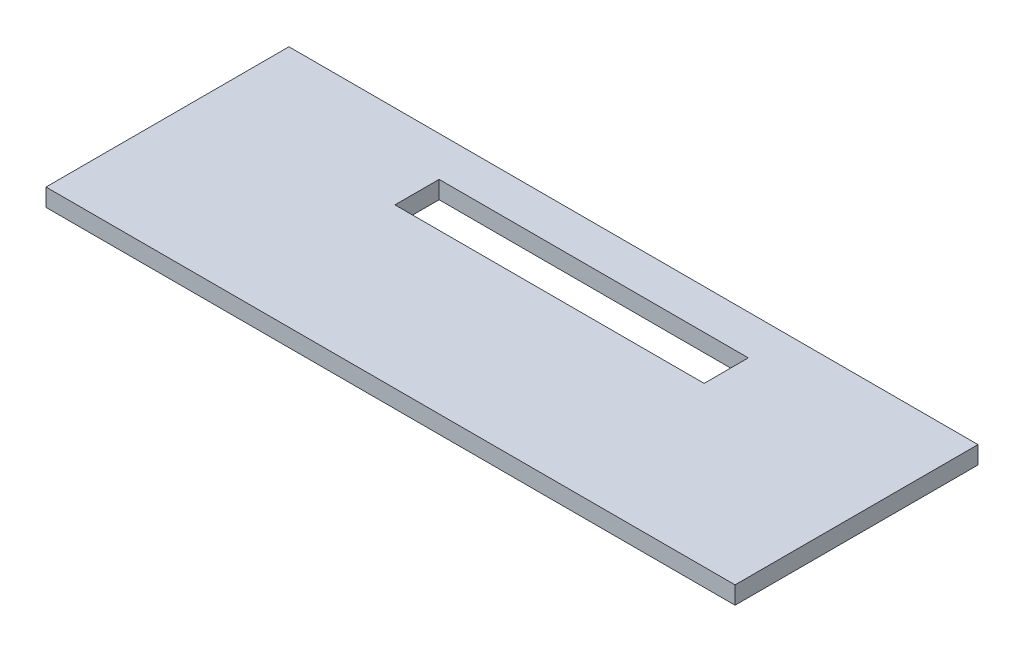
ISO-10303-21;
HEADER;
FILE_DESCRIPTION(('STEP AP214'),'2;1');
FILE_NAME('part.step','',(''),(''),'','','');
FILE_SCHEMA(('AUTOMOTIVE_DESIGN { 1 0 10303 214 1 1 1 1 }'));
ENDSEC;
DATA;
#1=APPLICATION_CONTEXT('core data for automotive mechanical design processes');
#2=APPLICATION_PROTOCOL_DEFINITION('international standard','automotive_design',2000,#1);
#3=PRODUCT_CONTEXT('',#1,'mechanical');
#4=PRODUCT('Part','Part','',(#3));
#5=PRODUCT_RELATED_PRODUCT_CATEGORY('part','',(#4));
#6=PRODUCT_DEFINITION_FORMATION('','',#4);
#7=PRODUCT_DEFINITION_CONTEXT('part definition',#1,'design');
#8=PRODUCT_DEFINITION('design','',#6,#7);
#9=PRODUCT_DEFINITION_SHAPE('','',#8);
#10=(LENGTH_UNIT() NAMED_UNIT(*) SI_UNIT(.MILLI.,.METRE.));
#11=(NAMED_UNIT(*) PLANE_ANGLE_UNIT() SI_UNIT($,.RADIAN.));
#12=(NAMED_UNIT(*) SI_UNIT($,.STERADIAN.) SOLID_ANGLE_UNIT());
#13=UNCERTAINTY_MEASURE_WITH_UNIT(LENGTH_MEASURE(1.E-05),#10,'distance_accuracy_value','');
#14=(GEOMETRIC_REPRESENTATION_CONTEXT(3) GLOBAL_UNCERTAINTY_ASSIGNED_CONTEXT((#13)) GLOBAL_UNIT_ASSIGNED_CONTEXT((#10,
#11,#12)) REPRESENTATION_CONTEXT('',''));
#15=CARTESIAN_POINT('',(0.,0.,0.));
#16=DIRECTION('',(0.,0.,1.));
#17=DIRECTION('',(1.,0.,0.));
#18=AXIS2_PLACEMENT_3D('',#15,#16,#17);
#19=CARTESIAN_POINT('',(0.,4.,0.));
#20=DIRECTION('',(0.,1.,0.));
#21=DIRECTION('',(0.,0.,1.));
#22=AXIS2_PLACEMENT_3D('',#19,#20,#21);
#23=PLANE('',#22);
#24=DIRECTION('',(0.,0.,-1.));
#25=VECTOR('',#24,1.);
#26=CARTESIAN_POINT('',(78.,4.,-27.5));
#27=LINE('',#26,#25);
#28=CARTESIAN_POINT('',(78.,4.,27.5));
#29=VERTEX_POINT('',#28);
#30=CARTESIAN_POINT('',(78.,4.,-27.5));
#31=VERTEX_POINT('',#30);
#32=EDGE_CURVE('E134',#29,#31,#27,.T.);
#33=ORIENTED_EDGE('',*,*,#32,.T.);
#34=DIRECTION('',(-1.,0.,0.));
#35=VECTOR('',#34,1.);
#36=CARTESIAN_POINT('',(-78.,4.,-27.5));
#37=LINE('',#36,#35);
#38=CARTESIAN_POINT('',(-78.,4.,-27.5));
#39=VERTEX_POINT('',#38);
#40=EDGE_CURVE('E137',#31,#39,#37,.T.);
#41=ORIENTED_EDGE('',*,*,#40,.T.);
#42=DIRECTION('',(0.,0.,1.));
#43=VECTOR('',#42,1.);
#44=CARTESIAN_POINT('',(-78.,4.,-27.5));
#45=LINE('',#44,#43);
#46=CARTESIAN_POINT('',(-78.,4.,27.5));
#47=VERTEX_POINT('',#46);
#48=EDGE_CURVE('E140',#39,#47,#45,.T.);
#49=ORIENTED_EDGE('',*,*,#48,.T.);
#50=DIRECTION('',(1.,0.,0.));
#51=VECTOR('',#50,1.);
#52=CARTESIAN_POINT('',(-78.,4.,27.5));
#53=LINE('',#52,#51);
#54=EDGE_CURVE('E142',#47,#29,#53,.T.);
#55=ORIENTED_EDGE('',*,*,#54,.T.);
#56=EDGE_LOOP('',(#33,#41,#49,#55));
#57=FACE_BOUND('',#56,.T.);
#58=DIRECTION('',(1.,0.,0.));
#59=VECTOR('',#58,1.);
#60=CARTESIAN_POINT('',(-35.,4.,-8.5));
#61=LINE('',#60,#59);
#62=CARTESIAN_POINT('',(-35.,4.,-8.5));
#63=VERTEX_POINT('',#62);
#64=CARTESIAN_POINT('',(35.,4.,-8.5));
#65=VERTEX_POINT('',#64);
#66=EDGE_CURVE('E106',#63,#65,#61,.T.);
#67=ORIENTED_EDGE('',*,*,#66,.F.);
#68=DIRECTION('',(0.,0.,1.));
#69=VECTOR('',#68,1.);
#70=CARTESIAN_POINT('',(-35.,4.,-18.5));
#71=LINE('',#70,#69);
#72=CARTESIAN_POINT('',(-35.,4.,-18.5));
#73=VERTEX_POINT('',#72);
#74=EDGE_CURVE('E98',#73,#63,#71,.T.);
#75=ORIENTED_EDGE('',*,*,#74,.F.);
#76=DIRECTION('',(-1.,0.,0.));
#77=VECTOR('',#76,1.);
#78=CARTESIAN_POINT('',(-35.,4.,-18.5));
#79=LINE('',#78,#77);
#80=CARTESIAN_POINT('',(35.,4.,-18.5));
#81=VERTEX_POINT('',#80);
#82=EDGE_CURVE('E120',#81,#73,#79,.T.);
#83=ORIENTED_EDGE('',*,*,#82,.F.);
#84=DIRECTION('',(0.,0.,-1.));
#85=VECTOR('',#84,1.);
#86=CARTESIAN_POINT('',(35.,4.,-18.5));
#87=LINE('',#86,#85);
#88=EDGE_CURVE('E118',#65,#81,#87,.T.);
#89=ORIENTED_EDGE('',*,*,#88,.F.);
#90=EDGE_LOOP('',(#67,#75,#83,#89));
#91=FACE_BOUND('',#90,.T.);
#92=ADVANCED_FACE('F33',(#57,#91),#23,.T.);
#93=CARTESIAN_POINT('',(0.,0.,0.));
#94=DIRECTION('',(0.,1.,0.));
#95=DIRECTION('',(0.,0.,1.));
#96=AXIS2_PLACEMENT_3D('',#93,#94,#95);
#97=PLANE('',#96);
#98=DIRECTION('',(0.,0.,-1.));
#99=VECTOR('',#98,1.);
#100=CARTESIAN_POINT('',(78.,0.,-27.5));
#101=LINE('',#100,#99);
#102=CARTESIAN_POINT('',(78.,0.,27.5));
#103=VERTEX_POINT('',#102);
#104=CARTESIAN_POINT('',(78.,0.,-27.5));
#105=VERTEX_POINT('',#104);
#106=EDGE_CURVE('E114',#103,#105,#101,.T.);
#107=ORIENTED_EDGE('',*,*,#106,.F.);
#108=DIRECTION('',(1.,0.,0.));
#109=VECTOR('',#108,1.);
#110=CARTESIAN_POINT('',(-78.,0.,27.5));
#111=LINE('',#110,#109);
#112=CARTESIAN_POINT('',(-78.,0.,27.5));
#113=VERTEX_POINT('',#112);
#114=EDGE_CURVE('E138',#113,#103,#111,.T.);
#115=ORIENTED_EDGE('',*,*,#114,.F.);
#116=DIRECTION('',(0.,0.,1.));
#117=VECTOR('',#116,1.);
#118=CARTESIAN_POINT('',(-78.,0.,-27.5));
#119=LINE('',#118,#117);
#120=CARTESIAN_POINT('',(-78.,0.,-27.5));
#121=VERTEX_POINT('',#120);
#122=EDGE_CURVE('E149',#121,#113,#119,.T.);
#123=ORIENTED_EDGE('',*,*,#122,.F.);
#124=DIRECTION('',(-1.,0.,0.));
#125=VECTOR('',#124,1.);
#126=CARTESIAN_POINT('',(-78.,0.,-27.5));
#127=LINE('',#126,#125);
#128=EDGE_CURVE('E147',#105,#121,#127,.T.);
#129=ORIENTED_EDGE('',*,*,#128,.F.);
#130=EDGE_LOOP('',(#107,#115,#123,#129));
#131=FACE_BOUND('',#130,.T.);
#132=DIRECTION('',(0.,0.,1.));
#133=VECTOR('',#132,1.);
#134=CARTESIAN_POINT('',(-35.,0.,-18.5));
#135=LINE('',#134,#133);
#136=CARTESIAN_POINT('',(-35.,0.,-18.5));
#137=VERTEX_POINT('',#136);
#138=CARTESIAN_POINT('',(-35.,0.,-8.5));
#139=VERTEX_POINT('',#138);
#140=EDGE_CURVE('E56',#137,#139,#135,.T.);
#141=ORIENTED_EDGE('',*,*,#140,.T.);
#142=DIRECTION('',(1.,0.,0.));
#143=VECTOR('',#142,1.);
#144=CARTESIAN_POINT('',(-35.,0.,-8.5));
#145=LINE('',#144,#143);
#146=CARTESIAN_POINT('',(35.,0.,-8.5));
#147=VERTEX_POINT('',#146);
#148=EDGE_CURVE('E113',#139,#147,#145,.T.);
#149=ORIENTED_EDGE('',*,*,#148,.T.);
#150=DIRECTION('',(0.,0.,-1.));
#151=VECTOR('',#150,1.);
#152=CARTESIAN_POINT('',(35.,0.,-18.5));
#153=LINE('',#152,#151);
#154=CARTESIAN_POINT('',(35.,0.,-18.5));
#155=VERTEX_POINT('',#154);
#156=EDGE_CURVE('E126',#147,#155,#153,.T.);
#157=ORIENTED_EDGE('',*,*,#156,.T.);
#158=DIRECTION('',(-1.,0.,0.));
#159=VECTOR('',#158,1.);
#160=CARTESIAN_POINT('',(-35.,0.,-18.5));
#161=LINE('',#160,#159);
#162=EDGE_CURVE('E107',#155,#137,#161,.T.);
#163=ORIENTED_EDGE('',*,*,#162,.T.);
#164=EDGE_LOOP('',(#141,#149,#157,#163));
#165=FACE_BOUND('',#164,.T.);
#166=ADVANCED_FACE('F167',(#131,#165),#97,.F.);
#167=CARTESIAN_POINT('',(78.,4.,-27.5));
#168=DIRECTION('',(-1.,0.,0.));
#169=DIRECTION('',(0.,0.,1.));
#170=AXIS2_PLACEMENT_3D('',#167,#168,#169);
#171=PLANE('',#170);
#172=ORIENTED_EDGE('',*,*,#106,.T.);
#173=DIRECTION('',(0.,-1.,0.));
#174=VECTOR('',#173,1.);
#175=CARTESIAN_POINT('',(78.,4.,-27.5));
#176=LINE('',#175,#174);
#177=EDGE_CURVE('E11',#31,#105,#176,.T.);
#178=ORIENTED_EDGE('',*,*,#177,.F.);
#179=ORIENTED_EDGE('',*,*,#32,.F.);
#180=DIRECTION('',(0.,-1.,0.));
#181=VECTOR('',#180,1.);
#182=CARTESIAN_POINT('',(78.,4.,27.5));
#183=LINE('',#182,#181);
#184=EDGE_CURVE('E144',#29,#103,#183,.T.);
#185=ORIENTED_EDGE('',*,*,#184,.T.);
#186=EDGE_LOOP('',(#172,#178,#179,#185));
#187=FACE_BOUND('',#186,.T.);
#188=ADVANCED_FACE('F35',(#187),#171,.F.);
#189=CARTESIAN_POINT('',(-78.,4.,-27.5));
#190=DIRECTION('',(0.,0.,1.));
#191=DIRECTION('',(1.,0.,0.));
#192=AXIS2_PLACEMENT_3D('',#189,#190,#191);
#193=PLANE('',#192);
#194=ORIENTED_EDGE('',*,*,#128,.T.);
#195=DIRECTION('',(0.,-1.,0.));
#196=VECTOR('',#195,1.);
#197=CARTESIAN_POINT('',(-78.,4.,-27.5));
#198=LINE('',#197,#196);
#199=EDGE_CURVE('E41',#39,#121,#198,.T.);
#200=ORIENTED_EDGE('',*,*,#199,.F.);
#201=ORIENTED_EDGE('',*,*,#40,.F.);
#202=ORIENTED_EDGE('',*,*,#177,.T.);
#203=EDGE_LOOP('',(#194,#200,#201,#202));
#204=FACE_BOUND('',#203,.T.);
#205=ADVANCED_FACE('F177',(#204),#193,.F.);
#206=CARTESIAN_POINT('',(-78.,4.,-27.5));
#207=DIRECTION('',(1.,0.,0.));
#208=DIRECTION('',(0.,0.,-1.));
#209=AXIS2_PLACEMENT_3D('',#206,#207,#208);
#210=PLANE('',#209);
#211=ORIENTED_EDGE('',*,*,#122,.T.);
#212=DIRECTION('',(0.,-1.,0.));
#213=VECTOR('',#212,1.);
#214=CARTESIAN_POINT('',(-78.,4.,27.5));
#215=LINE('',#214,#213);
#216=EDGE_CURVE('E154',#47,#113,#215,.T.);
#217=ORIENTED_EDGE('',*,*,#216,.F.);
#218=ORIENTED_EDGE('',*,*,#48,.F.);
#219=ORIENTED_EDGE('',*,*,#199,.T.);
#220=EDGE_LOOP('',(#211,#217,#218,#219));
#221=FACE_BOUND('',#220,.T.);
#222=ADVANCED_FACE('F161',(#221),#210,.F.);
#223=CARTESIAN_POINT('',(-78.,4.,27.5));
#224=DIRECTION('',(0.,0.,-1.));
#225=DIRECTION('',(-1.,0.,0.));
#226=AXIS2_PLACEMENT_3D('',#223,#224,#225);
#227=PLANE('',#226);
#228=ORIENTED_EDGE('',*,*,#114,.T.);
#229=ORIENTED_EDGE('',*,*,#184,.F.);
#230=ORIENTED_EDGE('',*,*,#54,.F.);
#231=ORIENTED_EDGE('',*,*,#216,.T.);
#232=EDGE_LOOP('',(#228,#229,#230,#231));
#233=FACE_BOUND('',#232,.T.);
#234=ADVANCED_FACE('F171',(#233),#227,.F.);
#235=CARTESIAN_POINT('',(-35.,4.,-18.5));
#236=DIRECTION('',(1.,0.,0.));
#237=DIRECTION('',(0.,0.,-1.));
#238=AXIS2_PLACEMENT_3D('',#235,#236,#237);
#239=PLANE('',#238);
#240=ORIENTED_EDGE('',*,*,#140,.F.);
#241=DIRECTION('',(0.,-1.,0.));
#242=VECTOR('',#241,1.);
#243=CARTESIAN_POINT('',(-35.,4.,-18.5));
#244=LINE('',#243,#242);
#245=EDGE_CURVE('E102',#73,#137,#244,.T.);
#246=ORIENTED_EDGE('',*,*,#245,.F.);
#247=ORIENTED_EDGE('',*,*,#74,.T.);
#248=DIRECTION('',(0.,-1.,0.));
#249=VECTOR('',#248,1.);
#250=CARTESIAN_POINT('',(-35.,4.,-8.5));
#251=LINE('',#250,#249);
#252=EDGE_CURVE('E101',#63,#139,#251,.T.);
#253=ORIENTED_EDGE('',*,*,#252,.T.);
#254=EDGE_LOOP('',(#240,#246,#247,#253));
#255=FACE_BOUND('',#254,.T.);
#256=ADVANCED_FACE('F100',(#255),#239,.T.);
#257=CARTESIAN_POINT('',(-35.,4.,-8.5));
#258=DIRECTION('',(0.,0.,-1.));
#259=DIRECTION('',(-1.,0.,0.));
#260=AXIS2_PLACEMENT_3D('',#257,#258,#259);
#261=PLANE('',#260);
#262=ORIENTED_EDGE('',*,*,#148,.F.);
#263=ORIENTED_EDGE('',*,*,#252,.F.);
#264=ORIENTED_EDGE('',*,*,#66,.T.);
#265=DIRECTION('',(0.,-1.,0.));
#266=VECTOR('',#265,1.);
#267=CARTESIAN_POINT('',(35.,4.,-8.5));
#268=LINE('',#267,#266);
#269=EDGE_CURVE('E115',#65,#147,#268,.T.);
#270=ORIENTED_EDGE('',*,*,#269,.T.);
#271=EDGE_LOOP('',(#262,#263,#264,#270));
#272=FACE_BOUND('',#271,.T.);
#273=ADVANCED_FACE('F110',(#272),#261,.T.);
#274=CARTESIAN_POINT('',(35.,4.,-18.5));
#275=DIRECTION('',(-1.,0.,0.));
#276=DIRECTION('',(0.,0.,1.));
#277=AXIS2_PLACEMENT_3D('',#274,#275,#276);
#278=PLANE('',#277);
#279=ORIENTED_EDGE('',*,*,#156,.F.);
#280=ORIENTED_EDGE('',*,*,#269,.F.);
#281=ORIENTED_EDGE('',*,*,#88,.T.);
#282=DIRECTION('',(0.,-1.,0.));
#283=VECTOR('',#282,1.);
#284=CARTESIAN_POINT('',(35.,4.,-18.5));
#285=LINE('',#284,#283);
#286=EDGE_CURVE('E48',#81,#155,#285,.T.);
#287=ORIENTED_EDGE('',*,*,#286,.T.);
#288=EDGE_LOOP('',(#279,#280,#281,#287));
#289=FACE_BOUND('',#288,.T.);
#290=ADVANCED_FACE('F200',(#289),#278,.T.);
#291=CARTESIAN_POINT('',(-35.,4.,-18.5));
#292=DIRECTION('',(0.,0.,1.));
#293=DIRECTION('',(1.,0.,0.));
#294=AXIS2_PLACEMENT_3D('',#291,#292,#293);
#295=PLANE('',#294);
#296=ORIENTED_EDGE('',*,*,#162,.F.);
#297=ORIENTED_EDGE('',*,*,#286,.F.);
#298=ORIENTED_EDGE('',*,*,#82,.T.);
#299=ORIENTED_EDGE('',*,*,#245,.T.);
#300=EDGE_LOOP('',(#296,#297,#298,#299));
#301=FACE_BOUND('',#300,.T.);
#302=ADVANCED_FACE('F204',(#301),#295,.T.);
#303=CLOSED_SHELL('',(#92,#166,#188,#205,#222,#234,#256,#273,#290,#302));
#304=MANIFOLD_SOLID_BREP('B2',#303);
#305=ADVANCED_BREP_SHAPE_REPRESENTATION('',(#18,#304),#14);
#306=SHAPE_DEFINITION_REPRESENTATION(#9,#305);
ENDSEC;
END-ISO-10303-21;
